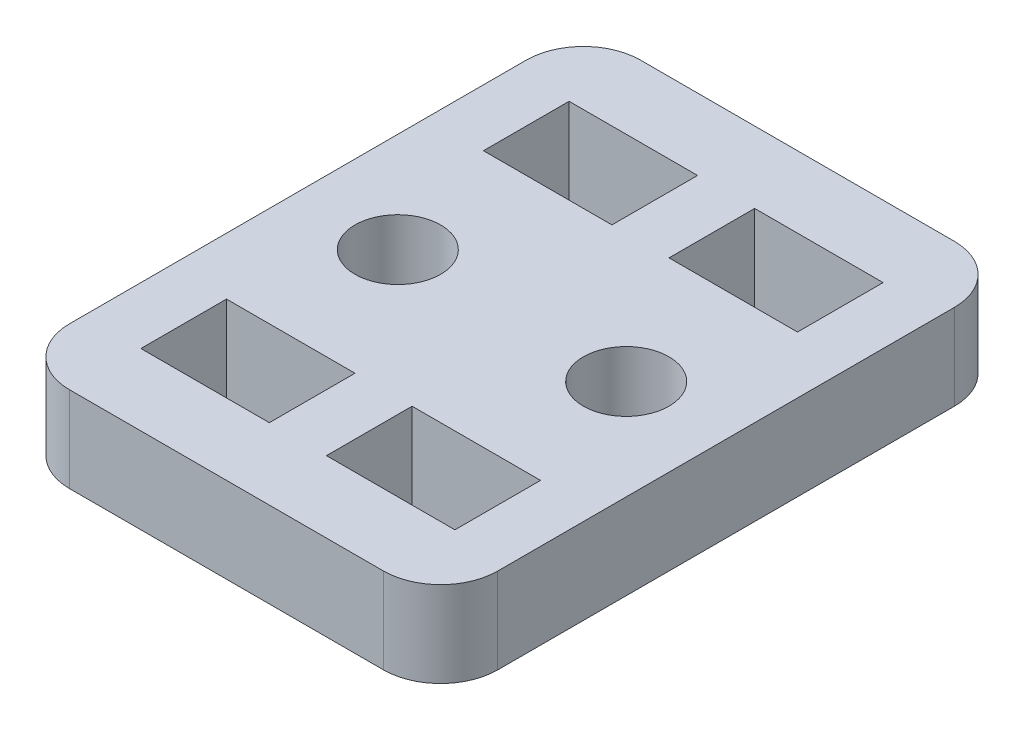
ISO-10303-21;
HEADER;
FILE_DESCRIPTION(('STEP AP214'),'2;1');
FILE_NAME('part.step','',(''),(''),'','','');
FILE_SCHEMA(('AUTOMOTIVE_DESIGN { 1 0 10303 214 1 1 1 1 }'));
ENDSEC;
DATA;
#1=APPLICATION_CONTEXT('core data for automotive mechanical design processes');
#2=APPLICATION_PROTOCOL_DEFINITION('international standard','automotive_design',2000,#1);
#3=PRODUCT_CONTEXT('',#1,'mechanical');
#4=PRODUCT('Part','Part','',(#3));
#5=PRODUCT_RELATED_PRODUCT_CATEGORY('part','',(#4));
#6=PRODUCT_DEFINITION_FORMATION('','',#4);
#7=PRODUCT_DEFINITION_CONTEXT('part definition',#1,'design');
#8=PRODUCT_DEFINITION('design','',#6,#7);
#9=PRODUCT_DEFINITION_SHAPE('','',#8);
#10=(LENGTH_UNIT() NAMED_UNIT(*) SI_UNIT(.MILLI.,.METRE.));
#11=(NAMED_UNIT(*) PLANE_ANGLE_UNIT() SI_UNIT($,.RADIAN.));
#12=(NAMED_UNIT(*) SI_UNIT($,.STERADIAN.) SOLID_ANGLE_UNIT());
#13=UNCERTAINTY_MEASURE_WITH_UNIT(LENGTH_MEASURE(1.E-05),#10,'distance_accuracy_value','');
#14=(GEOMETRIC_REPRESENTATION_CONTEXT(3) GLOBAL_UNCERTAINTY_ASSIGNED_CONTEXT((#13)) GLOBAL_UNIT_ASSIGNED_CONTEXT((#10,
#11,#12)) REPRESENTATION_CONTEXT('',''));
#15=CARTESIAN_POINT('',(0.,0.,0.));
#16=DIRECTION('',(0.,0.,1.));
#17=DIRECTION('',(1.,0.,0.));
#18=AXIS2_PLACEMENT_3D('',#15,#16,#17);
#19=CARTESIAN_POINT('',(0.,0.,0.));
#20=DIRECTION('',(0.,1.,0.));
#21=DIRECTION('',(0.,0.,1.));
#22=AXIS2_PLACEMENT_3D('',#19,#20,#21);
#23=PLANE('',#22);
#24=CARTESIAN_POINT('',(-4.,0.,0.));
#25=DIRECTION('',(0.,1.,0.));
#26=DIRECTION('',(0.,0.,1.));
#27=AXIS2_PLACEMENT_3D('',#24,#25,#26);
#28=CIRCLE('',#27,1.5);
#29=CARTESIAN_POINT('',(-4.,0.,1.5));
#30=VERTEX_POINT('',#29);
#31=EDGE_CURVE('E315',#30,#30,#28,.T.);
#32=ORIENTED_EDGE('',*,*,#31,.T.);
#33=EDGE_LOOP('',(#32));
#34=FACE_BOUND('',#33,.T.);
#35=CARTESIAN_POINT('',(4.,0.,0.));
#36=DIRECTION('',(0.,1.,0.));
#37=DIRECTION('',(0.,0.,1.));
#38=AXIS2_PLACEMENT_3D('',#35,#36,#37);
#39=CIRCLE('',#38,1.5);
#40=CARTESIAN_POINT('',(4.,0.,1.5));
#41=VERTEX_POINT('',#40);
#42=EDGE_CURVE('E830',#41,#41,#39,.T.);
#43=ORIENTED_EDGE('',*,*,#42,.T.);
#44=EDGE_LOOP('',(#43));
#45=FACE_BOUND('',#44,.T.);
#46=DIRECTION('',(0.,0.,-1.));
#47=VECTOR('',#46,1.);
#48=CARTESIAN_POINT('',(1.,0.,-4.5));
#49=LINE('',#48,#47);
#50=CARTESIAN_POINT('',(1.,0.,-4.5));
#51=VERTEX_POINT('',#50);
#52=CARTESIAN_POINT('',(1.,0.,-7.5));
#53=VERTEX_POINT('',#52);
#54=EDGE_CURVE('E75',#51,#53,#49,.T.);
#55=ORIENTED_EDGE('',*,*,#54,.F.);
#56=DIRECTION('',(-1.,0.,0.));
#57=VECTOR('',#56,1.);
#58=CARTESIAN_POINT('',(5.5,0.,-4.5));
#59=LINE('',#58,#57);
#60=CARTESIAN_POINT('',(5.5,0.,-4.5));
#61=VERTEX_POINT('',#60);
#62=EDGE_CURVE('E310',#61,#51,#59,.T.);
#63=ORIENTED_EDGE('',*,*,#62,.F.);
#64=DIRECTION('',(0.,0.,1.));
#65=VECTOR('',#64,1.);
#66=CARTESIAN_POINT('',(5.5,0.,-7.5));
#67=LINE('',#66,#65);
#68=CARTESIAN_POINT('',(5.5,0.,-7.5));
#69=VERTEX_POINT('',#68);
#70=EDGE_CURVE('E338',#69,#61,#67,.T.);
#71=ORIENTED_EDGE('',*,*,#70,.F.);
#72=DIRECTION('',(1.,0.,0.));
#73=VECTOR('',#72,1.);
#74=CARTESIAN_POINT('',(1.,0.,-7.5));
#75=LINE('',#74,#73);
#76=EDGE_CURVE('E336',#53,#69,#75,.T.);
#77=ORIENTED_EDGE('',*,*,#76,.F.);
#78=EDGE_LOOP('',(#55,#63,#71,#77));
#79=FACE_BOUND('',#78,.T.);
#80=DIRECTION('',(-1.,0.,0.));
#81=VECTOR('',#80,1.);
#82=CARTESIAN_POINT('',(5.5,0.,7.5));
#83=LINE('',#82,#81);
#84=CARTESIAN_POINT('',(5.5,0.,7.5));
#85=VERTEX_POINT('',#84);
#86=CARTESIAN_POINT('',(1.,0.,7.5));
#87=VERTEX_POINT('',#86);
#88=EDGE_CURVE('E285',#85,#87,#83,.T.);
#89=ORIENTED_EDGE('',*,*,#88,.F.);
#90=DIRECTION('',(0.,0.,1.));
#91=VECTOR('',#90,1.);
#92=CARTESIAN_POINT('',(5.5,0.,4.5));
#93=LINE('',#92,#91);
#94=CARTESIAN_POINT('',(5.5,0.,4.5));
#95=VERTEX_POINT('',#94);
#96=EDGE_CURVE('E309',#95,#85,#93,.T.);
#97=ORIENTED_EDGE('',*,*,#96,.F.);
#98=DIRECTION('',(1.,0.,0.));
#99=VECTOR('',#98,1.);
#100=CARTESIAN_POINT('',(1.,0.,4.5));
#101=LINE('',#100,#99);
#102=CARTESIAN_POINT('',(1.,0.,4.5));
#103=VERTEX_POINT('',#102);
#104=EDGE_CURVE('E272',#103,#95,#101,.T.);
#105=ORIENTED_EDGE('',*,*,#104,.F.);
#106=DIRECTION('',(0.,0.,-1.));
#107=VECTOR('',#106,1.);
#108=CARTESIAN_POINT('',(1.,0.,7.5));
#109=LINE('',#108,#107);
#110=EDGE_CURVE('E321',#87,#103,#109,.T.);
#111=ORIENTED_EDGE('',*,*,#110,.F.);
#112=EDGE_LOOP('',(#89,#97,#105,#111));
#113=FACE_BOUND('',#112,.T.);
#114=DIRECTION('',(-1.,0.,0.));
#115=VECTOR('',#114,1.);
#116=CARTESIAN_POINT('',(-1.,0.,-4.5));
#117=LINE('',#116,#115);
#118=CARTESIAN_POINT('',(-1.,0.,-4.5));
#119=VERTEX_POINT('',#118);
#120=CARTESIAN_POINT('',(-5.5,0.,-4.5));
#121=VERTEX_POINT('',#120);
#122=EDGE_CURVE('E316',#119,#121,#117,.T.);
#123=ORIENTED_EDGE('',*,*,#122,.F.);
#124=DIRECTION('',(0.,0.,1.));
#125=VECTOR('',#124,1.);
#126=CARTESIAN_POINT('',(-1.,0.,-7.5));
#127=LINE('',#126,#125);
#128=CARTESIAN_POINT('',(-1.,0.,-7.5));
#129=VERTEX_POINT('',#128);
#130=EDGE_CURVE('E402',#129,#119,#127,.T.);
#131=ORIENTED_EDGE('',*,*,#130,.F.);
#132=DIRECTION('',(1.,0.,0.));
#133=VECTOR('',#132,1.);
#134=CARTESIAN_POINT('',(-5.5,0.,-7.5));
#135=LINE('',#134,#133);
#136=CARTESIAN_POINT('',(-5.5,0.,-7.5));
#137=VERTEX_POINT('',#136);
#138=EDGE_CURVE('E175',#137,#129,#135,.T.);
#139=ORIENTED_EDGE('',*,*,#138,.F.);
#140=DIRECTION('',(0.,0.,-1.));
#141=VECTOR('',#140,1.);
#142=CARTESIAN_POINT('',(-5.5,0.,-4.5));
#143=LINE('',#142,#141);
#144=EDGE_CURVE('E249',#121,#137,#143,.T.);
#145=ORIENTED_EDGE('',*,*,#144,.F.);
#146=EDGE_LOOP('',(#123,#131,#139,#145));
#147=FACE_BOUND('',#146,.T.);
#148=DIRECTION('',(1.,0.,0.));
#149=VECTOR('',#148,1.);
#150=CARTESIAN_POINT('',(-5.5,0.,4.5));
#151=LINE('',#150,#149);
#152=CARTESIAN_POINT('',(-5.5,0.,4.5));
#153=VERTEX_POINT('',#152);
#154=CARTESIAN_POINT('',(-1.,0.,4.5));
#155=VERTEX_POINT('',#154);
#156=EDGE_CURVE('E290',#153,#155,#151,.T.);
#157=ORIENTED_EDGE('',*,*,#156,.F.);
#158=DIRECTION('',(0.,0.,-1.));
#159=VECTOR('',#158,1.);
#160=CARTESIAN_POINT('',(-5.5,0.,7.5));
#161=LINE('',#160,#159);
#162=CARTESIAN_POINT('',(-5.5,0.,7.5));
#163=VERTEX_POINT('',#162);
#164=EDGE_CURVE('E384',#163,#153,#161,.T.);
#165=ORIENTED_EDGE('',*,*,#164,.F.);
#166=DIRECTION('',(-1.,0.,0.));
#167=VECTOR('',#166,1.);
#168=CARTESIAN_POINT('',(-1.,0.,7.5));
#169=LINE('',#168,#167);
#170=CARTESIAN_POINT('',(-1.,0.,7.5));
#171=VERTEX_POINT('',#170);
#172=EDGE_CURVE('E237',#171,#163,#169,.T.);
#173=ORIENTED_EDGE('',*,*,#172,.F.);
#174=DIRECTION('',(0.,0.,1.));
#175=VECTOR('',#174,1.);
#176=CARTESIAN_POINT('',(-1.,0.,4.5));
#177=LINE('',#176,#175);
#178=EDGE_CURVE('E277',#155,#171,#177,.T.);
#179=ORIENTED_EDGE('',*,*,#178,.F.);
#180=EDGE_LOOP('',(#157,#165,#173,#179));
#181=FACE_BOUND('',#180,.T.);
#182=DIRECTION('',(-1.,0.,0.));
#183=VECTOR('',#182,1.);
#184=CARTESIAN_POINT('',(5.5,0.,-10.));
#185=LINE('',#184,#183);
#186=CARTESIAN_POINT('',(5.5,0.,-10.));
#187=VERTEX_POINT('',#186);
#188=CARTESIAN_POINT('',(-5.5,0.,-10.));
#189=VERTEX_POINT('',#188);
#190=EDGE_CURVE('E52',#187,#189,#185,.T.);
#191=ORIENTED_EDGE('',*,*,#190,.F.);
#192=CARTESIAN_POINT('',(5.5,0.,-8.));
#193=DIRECTION('',(0.,1.,0.));
#194=DIRECTION('',(1.,0.,0.));
#195=AXIS2_PLACEMENT_3D('',#192,#193,#194);
#196=CIRCLE('',#195,2.);
#197=CARTESIAN_POINT('',(7.5,0.,-8.));
#198=VERTEX_POINT('',#197);
#199=EDGE_CURVE('E305',#198,#187,#196,.T.);
#200=ORIENTED_EDGE('',*,*,#199,.F.);
#201=DIRECTION('',(0.,0.,-1.));
#202=VECTOR('',#201,1.);
#203=CARTESIAN_POINT('',(7.5,0.,8.));
#204=LINE('',#203,#202);
#205=CARTESIAN_POINT('',(7.5,0.,8.));
#206=VERTEX_POINT('',#205);
#207=EDGE_CURVE('E223',#206,#198,#204,.T.);
#208=ORIENTED_EDGE('',*,*,#207,.F.);
#209=CARTESIAN_POINT('',(5.5,0.,8.));
#210=DIRECTION('',(0.,1.,0.));
#211=DIRECTION('',(0.,0.,1.));
#212=AXIS2_PLACEMENT_3D('',#209,#210,#211);
#213=CIRCLE('',#212,2.);
#214=CARTESIAN_POINT('',(5.5,0.,10.));
#215=VERTEX_POINT('',#214);
#216=EDGE_CURVE('E217',#215,#206,#213,.T.);
#217=ORIENTED_EDGE('',*,*,#216,.F.);
#218=DIRECTION('',(1.,0.,0.));
#219=VECTOR('',#218,1.);
#220=CARTESIAN_POINT('',(-5.5,0.,10.));
#221=LINE('',#220,#219);
#222=CARTESIAN_POINT('',(-5.5,0.,10.));
#223=VERTEX_POINT('',#222);
#224=EDGE_CURVE('E45',#223,#215,#221,.T.);
#225=ORIENTED_EDGE('',*,*,#224,.F.);
#226=CARTESIAN_POINT('',(-5.5,0.,8.));
#227=DIRECTION('',(0.,1.,0.));
#228=DIRECTION('',(-1.,0.,0.));
#229=AXIS2_PLACEMENT_3D('',#226,#227,#228);
#230=CIRCLE('',#229,2.);
#231=CARTESIAN_POINT('',(-7.5,0.,8.));
#232=VERTEX_POINT('',#231);
#233=EDGE_CURVE('E243',#232,#223,#230,.T.);
#234=ORIENTED_EDGE('',*,*,#233,.F.);
#235=DIRECTION('',(0.,0.,1.));
#236=VECTOR('',#235,1.);
#237=CARTESIAN_POINT('',(-7.5,0.,-8.));
#238=LINE('',#237,#236);
#239=CARTESIAN_POINT('',(-7.5,0.,-8.));
#240=VERTEX_POINT('',#239);
#241=EDGE_CURVE('E146',#240,#232,#238,.T.);
#242=ORIENTED_EDGE('',*,*,#241,.F.);
#243=CARTESIAN_POINT('',(-5.5,0.,-8.));
#244=DIRECTION('',(0.,1.,0.));
#245=DIRECTION('',(0.,0.,-1.));
#246=AXIS2_PLACEMENT_3D('',#243,#244,#245);
#247=CIRCLE('',#246,2.);
#248=EDGE_CURVE('E267',#189,#240,#247,.T.);
#249=ORIENTED_EDGE('',*,*,#248,.F.);
#250=EDGE_LOOP('',(#191,#200,#208,#217,#225,#234,#242,#249));
#251=FACE_BOUND('',#250,.T.);
#252=ADVANCED_FACE('F41',(#34,#45,#79,#113,#147,#181,#251),#23,.F.);
#253=CARTESIAN_POINT('',(0.,3.,0.));
#254=DIRECTION('',(0.,1.,0.));
#255=DIRECTION('',(0.,0.,1.));
#256=AXIS2_PLACEMENT_3D('',#253,#254,#255);
#257=PLANE('',#256);
#258=CARTESIAN_POINT('',(-4.,3.,0.));
#259=DIRECTION('',(0.,1.,0.));
#260=DIRECTION('',(0.,0.,1.));
#261=AXIS2_PLACEMENT_3D('',#258,#259,#260);
#262=CIRCLE('',#261,1.5);
#263=CARTESIAN_POINT('',(-4.,3.,1.5));
#264=VERTEX_POINT('',#263);
#265=EDGE_CURVE('E828',#264,#264,#262,.T.);
#266=ORIENTED_EDGE('',*,*,#265,.F.);
#267=EDGE_LOOP('',(#266));
#268=FACE_BOUND('',#267,.T.);
#269=CARTESIAN_POINT('',(4.,3.,0.));
#270=DIRECTION('',(0.,1.,0.));
#271=DIRECTION('',(0.,0.,1.));
#272=AXIS2_PLACEMENT_3D('',#269,#270,#271);
#273=CIRCLE('',#272,1.5);
#274=CARTESIAN_POINT('',(4.,3.,1.5));
#275=VERTEX_POINT('',#274);
#276=EDGE_CURVE('E834',#275,#275,#273,.T.);
#277=ORIENTED_EDGE('',*,*,#276,.F.);
#278=EDGE_LOOP('',(#277));
#279=FACE_BOUND('',#278,.T.);
#280=DIRECTION('',(0.,0.,-1.));
#281=VECTOR('',#280,1.);
#282=CARTESIAN_POINT('',(1.,3.,-4.5));
#283=LINE('',#282,#281);
#284=CARTESIAN_POINT('',(1.,3.,-4.5));
#285=VERTEX_POINT('',#284);
#286=CARTESIAN_POINT('',(1.,3.,-7.5));
#287=VERTEX_POINT('',#286);
#288=EDGE_CURVE('E306',#285,#287,#283,.T.);
#289=ORIENTED_EDGE('',*,*,#288,.T.);
#290=DIRECTION('',(1.,0.,0.));
#291=VECTOR('',#290,1.);
#292=CARTESIAN_POINT('',(1.,3.,-7.5));
#293=LINE('',#292,#291);
#294=CARTESIAN_POINT('',(5.5,3.,-7.5));
#295=VERTEX_POINT('',#294);
#296=EDGE_CURVE('E86',#287,#295,#293,.T.);
#297=ORIENTED_EDGE('',*,*,#296,.T.);
#298=DIRECTION('',(0.,0.,1.));
#299=VECTOR('',#298,1.);
#300=CARTESIAN_POINT('',(5.5,3.,-7.5));
#301=LINE('',#300,#299);
#302=CARTESIAN_POINT('',(5.5,3.,-4.5));
#303=VERTEX_POINT('',#302);
#304=EDGE_CURVE('E337',#295,#303,#301,.T.);
#305=ORIENTED_EDGE('',*,*,#304,.T.);
#306=DIRECTION('',(-1.,0.,0.));
#307=VECTOR('',#306,1.);
#308=CARTESIAN_POINT('',(5.5,3.,-4.5));
#309=LINE('',#308,#307);
#310=EDGE_CURVE('E374',#303,#285,#309,.T.);
#311=ORIENTED_EDGE('',*,*,#310,.T.);
#312=EDGE_LOOP('',(#289,#297,#305,#311));
#313=FACE_BOUND('',#312,.T.);
#314=DIRECTION('',(-1.,0.,0.));
#315=VECTOR('',#314,1.);
#316=CARTESIAN_POINT('',(5.5,3.,7.5));
#317=LINE('',#316,#315);
#318=CARTESIAN_POINT('',(5.5,3.,7.5));
#319=VERTEX_POINT('',#318);
#320=CARTESIAN_POINT('',(1.,3.,7.5));
#321=VERTEX_POINT('',#320);
#322=EDGE_CURVE('E183',#319,#321,#317,.T.);
#323=ORIENTED_EDGE('',*,*,#322,.T.);
#324=DIRECTION('',(0.,0.,-1.));
#325=VECTOR('',#324,1.);
#326=CARTESIAN_POINT('',(1.,3.,7.5));
#327=LINE('',#326,#325);
#328=CARTESIAN_POINT('',(1.,3.,4.5));
#329=VERTEX_POINT('',#328);
#330=EDGE_CURVE('E286',#321,#329,#327,.T.);
#331=ORIENTED_EDGE('',*,*,#330,.T.);
#332=DIRECTION('',(1.,0.,0.));
#333=VECTOR('',#332,1.);
#334=CARTESIAN_POINT('',(1.,3.,4.5));
#335=LINE('',#334,#333);
#336=CARTESIAN_POINT('',(5.5,3.,4.5));
#337=VERTEX_POINT('',#336);
#338=EDGE_CURVE('E275',#329,#337,#335,.T.);
#339=ORIENTED_EDGE('',*,*,#338,.T.);
#340=DIRECTION('',(0.,0.,1.));
#341=VECTOR('',#340,1.);
#342=CARTESIAN_POINT('',(5.5,3.,4.5));
#343=LINE('',#342,#341);
#344=EDGE_CURVE('E330',#337,#319,#343,.T.);
#345=ORIENTED_EDGE('',*,*,#344,.T.);
#346=EDGE_LOOP('',(#323,#331,#339,#345));
#347=FACE_BOUND('',#346,.T.);
#348=DIRECTION('',(-1.,0.,0.));
#349=VECTOR('',#348,1.);
#350=CARTESIAN_POINT('',(-1.,3.,-4.5));
#351=LINE('',#350,#349);
#352=CARTESIAN_POINT('',(-1.,3.,-4.5));
#353=VERTEX_POINT('',#352);
#354=CARTESIAN_POINT('',(-5.5,3.,-4.5));
#355=VERTEX_POINT('',#354);
#356=EDGE_CURVE('E319',#353,#355,#351,.T.);
#357=ORIENTED_EDGE('',*,*,#356,.T.);
#358=DIRECTION('',(0.,0.,-1.));
#359=VECTOR('',#358,1.);
#360=CARTESIAN_POINT('',(-5.5,3.,-4.5));
#361=LINE('',#360,#359);
#362=CARTESIAN_POINT('',(-5.5,3.,-7.5));
#363=VERTEX_POINT('',#362);
#364=EDGE_CURVE('E253',#355,#363,#361,.T.);
#365=ORIENTED_EDGE('',*,*,#364,.T.);
#366=DIRECTION('',(1.,0.,0.));
#367=VECTOR('',#366,1.);
#368=CARTESIAN_POINT('',(-5.5,3.,-7.5));
#369=LINE('',#368,#367);
#370=CARTESIAN_POINT('',(-1.,3.,-7.5));
#371=VERTEX_POINT('',#370);
#372=EDGE_CURVE('E271',#363,#371,#369,.T.);
#373=ORIENTED_EDGE('',*,*,#372,.T.);
#374=DIRECTION('',(0.,0.,1.));
#375=VECTOR('',#374,1.);
#376=CARTESIAN_POINT('',(-1.,3.,-7.5));
#377=LINE('',#376,#375);
#378=EDGE_CURVE('E289',#371,#353,#377,.T.);
#379=ORIENTED_EDGE('',*,*,#378,.T.);
#380=EDGE_LOOP('',(#357,#365,#373,#379));
#381=FACE_BOUND('',#380,.T.);
#382=DIRECTION('',(1.,0.,0.));
#383=VECTOR('',#382,1.);
#384=CARTESIAN_POINT('',(-5.5,3.,4.5));
#385=LINE('',#384,#383);
#386=CARTESIAN_POINT('',(-5.5,3.,4.5));
#387=VERTEX_POINT('',#386);
#388=CARTESIAN_POINT('',(-1.,3.,4.5));
#389=VERTEX_POINT('',#388);
#390=EDGE_CURVE('E294',#387,#389,#385,.T.);
#391=ORIENTED_EDGE('',*,*,#390,.T.);
#392=DIRECTION('',(0.,0.,1.));
#393=VECTOR('',#392,1.);
#394=CARTESIAN_POINT('',(-1.,3.,4.5));
#395=LINE('',#394,#393);
#396=CARTESIAN_POINT('',(-1.,3.,7.5));
#397=VERTEX_POINT('',#396);
#398=EDGE_CURVE('E281',#389,#397,#395,.T.);
#399=ORIENTED_EDGE('',*,*,#398,.T.);
#400=DIRECTION('',(-1.,0.,0.));
#401=VECTOR('',#400,1.);
#402=CARTESIAN_POINT('',(-1.,3.,7.5));
#403=LINE('',#402,#401);
#404=CARTESIAN_POINT('',(-5.5,3.,7.5));
#405=VERTEX_POINT('',#404);
#406=EDGE_CURVE('E240',#397,#405,#403,.T.);
#407=ORIENTED_EDGE('',*,*,#406,.T.);
#408=DIRECTION('',(0.,0.,-1.));
#409=VECTOR('',#408,1.);
#410=CARTESIAN_POINT('',(-5.5,3.,7.5));
#411=LINE('',#410,#409);
#412=EDGE_CURVE('E399',#405,#387,#411,.T.);
#413=ORIENTED_EDGE('',*,*,#412,.T.);
#414=EDGE_LOOP('',(#391,#399,#407,#413));
#415=FACE_BOUND('',#414,.T.);
#416=DIRECTION('',(-1.,0.,0.));
#417=VECTOR('',#416,1.);
#418=CARTESIAN_POINT('',(5.5,3.,-10.));
#419=LINE('',#418,#417);
#420=CARTESIAN_POINT('',(5.5,3.,-10.));
#421=VERTEX_POINT('',#420);
#422=CARTESIAN_POINT('',(-5.5,3.,-10.));
#423=VERTEX_POINT('',#422);
#424=EDGE_CURVE('E11',#421,#423,#419,.T.);
#425=ORIENTED_EDGE('',*,*,#424,.T.);
#426=CARTESIAN_POINT('',(-5.5,3.,-8.));
#427=DIRECTION('',(0.,1.,0.));
#428=DIRECTION('',(0.,0.,-1.));
#429=AXIS2_PLACEMENT_3D('',#426,#427,#428);
#430=CIRCLE('',#429,2.);
#431=CARTESIAN_POINT('',(-7.5,3.,-8.));
#432=VERTEX_POINT('',#431);
#433=EDGE_CURVE('E259',#423,#432,#430,.T.);
#434=ORIENTED_EDGE('',*,*,#433,.T.);
#435=DIRECTION('',(0.,0.,1.));
#436=VECTOR('',#435,1.);
#437=CARTESIAN_POINT('',(-7.5,3.,-8.));
#438=LINE('',#437,#436);
#439=CARTESIAN_POINT('',(-7.5,3.,8.));
#440=VERTEX_POINT('',#439);
#441=EDGE_CURVE('E268',#432,#440,#438,.T.);
#442=ORIENTED_EDGE('',*,*,#441,.T.);
#443=CARTESIAN_POINT('',(-5.5,3.,8.));
#444=DIRECTION('',(0.,1.,0.));
#445=DIRECTION('',(-1.,0.,0.));
#446=AXIS2_PLACEMENT_3D('',#443,#444,#445);
#447=CIRCLE('',#446,2.);
#448=CARTESIAN_POINT('',(-5.5,3.,10.));
#449=VERTEX_POINT('',#448);
#450=EDGE_CURVE('E152',#440,#449,#447,.T.);
#451=ORIENTED_EDGE('',*,*,#450,.T.);
#452=DIRECTION('',(1.,0.,0.));
#453=VECTOR('',#452,1.);
#454=CARTESIAN_POINT('',(-5.5,3.,10.));
#455=LINE('',#454,#453);
#456=CARTESIAN_POINT('',(5.5,3.,10.));
#457=VERTEX_POINT('',#456);
#458=EDGE_CURVE('E214',#449,#457,#455,.T.);
#459=ORIENTED_EDGE('',*,*,#458,.T.);
#460=CARTESIAN_POINT('',(5.5,3.,8.));
#461=DIRECTION('',(0.,1.,0.));
#462=DIRECTION('',(0.,0.,1.));
#463=AXIS2_PLACEMENT_3D('',#460,#461,#462);
#464=CIRCLE('',#463,2.);
#465=CARTESIAN_POINT('',(7.5,3.,8.));
#466=VERTEX_POINT('',#465);
#467=EDGE_CURVE('E198',#457,#466,#464,.T.);
#468=ORIENTED_EDGE('',*,*,#467,.T.);
#469=DIRECTION('',(0.,0.,-1.));
#470=VECTOR('',#469,1.);
#471=CARTESIAN_POINT('',(7.5,3.,8.));
#472=LINE('',#471,#470);
#473=CARTESIAN_POINT('',(7.5,3.,-8.));
#474=VERTEX_POINT('',#473);
#475=EDGE_CURVE('E232',#466,#474,#472,.T.);
#476=ORIENTED_EDGE('',*,*,#475,.T.);
#477=CARTESIAN_POINT('',(5.5,3.,-8.));
#478=DIRECTION('',(0.,1.,0.));
#479=DIRECTION('',(1.,0.,0.));
#480=AXIS2_PLACEMENT_3D('',#477,#478,#479);
#481=CIRCLE('',#480,2.);
#482=EDGE_CURVE('E244',#474,#421,#481,.T.);
#483=ORIENTED_EDGE('',*,*,#482,.T.);
#484=EDGE_LOOP('',(#425,#434,#442,#451,#459,#468,#476,#483));
#485=FACE_BOUND('',#484,.T.);
#486=ADVANCED_FACE('F423',(#268,#279,#313,#347,#381,#415,#485),#257,.T.);
#487=CARTESIAN_POINT('',(5.5,0.,-10.));
#488=DIRECTION('',(0.,0.,-1.));
#489=DIRECTION('',(-1.,0.,0.));
#490=AXIS2_PLACEMENT_3D('',#487,#488,#489);
#491=PLANE('',#490);
#492=ORIENTED_EDGE('',*,*,#190,.T.);
#493=DIRECTION('',(0.,1.,0.));
#494=VECTOR('',#493,1.);
#495=CARTESIAN_POINT('',(-5.5,0.,-10.));
#496=LINE('',#495,#494);
#497=EDGE_CURVE('E257',#189,#423,#496,.T.);
#498=ORIENTED_EDGE('',*,*,#497,.T.);
#499=ORIENTED_EDGE('',*,*,#424,.F.);
#500=DIRECTION('',(0.,1.,0.));
#501=VECTOR('',#500,1.);
#502=CARTESIAN_POINT('',(5.5,0.,-10.));
#503=LINE('',#502,#501);
#504=EDGE_CURVE('E248',#187,#421,#503,.T.);
#505=ORIENTED_EDGE('',*,*,#504,.F.);
#506=EDGE_LOOP('',(#492,#498,#499,#505));
#507=FACE_BOUND('',#506,.T.);
#508=ADVANCED_FACE('F520',(#507),#491,.T.);
#509=CARTESIAN_POINT('',(-5.5,0.,-8.));
#510=DIRECTION('',(0.,-1.,0.));
#511=DIRECTION('',(0.,0.,-1.));
#512=AXIS2_PLACEMENT_3D('',#509,#510,#511);
#513=CYLINDRICAL_SURFACE('',#512,2.);
#514=ORIENTED_EDGE('',*,*,#248,.T.);
#515=DIRECTION('',(0.,1.,0.));
#516=VECTOR('',#515,1.);
#517=CARTESIAN_POINT('',(-7.5,0.,-8.));
#518=LINE('',#517,#516);
#519=EDGE_CURVE('E264',#240,#432,#518,.T.);
#520=ORIENTED_EDGE('',*,*,#519,.T.);
#521=ORIENTED_EDGE('',*,*,#433,.F.);
#522=ORIENTED_EDGE('',*,*,#497,.F.);
#523=EDGE_LOOP('',(#514,#520,#521,#522));
#524=FACE_BOUND('',#523,.T.);
#525=ADVANCED_FACE('F43',(#524),#513,.T.);
#526=CARTESIAN_POINT('',(-7.5,0.,-8.));
#527=DIRECTION('',(-1.,0.,0.));
#528=DIRECTION('',(0.,0.,1.));
#529=AXIS2_PLACEMENT_3D('',#526,#527,#528);
#530=PLANE('',#529);
#531=ORIENTED_EDGE('',*,*,#241,.T.);
#532=DIRECTION('',(0.,1.,0.));
#533=VECTOR('',#532,1.);
#534=CARTESIAN_POINT('',(-7.5,0.,8.));
#535=LINE('',#534,#533);
#536=EDGE_CURVE('E262',#232,#440,#535,.T.);
#537=ORIENTED_EDGE('',*,*,#536,.T.);
#538=ORIENTED_EDGE('',*,*,#441,.F.);
#539=ORIENTED_EDGE('',*,*,#519,.F.);
#540=EDGE_LOOP('',(#531,#537,#538,#539));
#541=FACE_BOUND('',#540,.T.);
#542=ADVANCED_FACE('F538',(#541),#530,.T.);
#543=CARTESIAN_POINT('',(-5.5,0.,8.));
#544=DIRECTION('',(0.,-1.,0.));
#545=DIRECTION('',(-1.,0.,0.));
#546=AXIS2_PLACEMENT_3D('',#543,#544,#545);
#547=CYLINDRICAL_SURFACE('',#546,2.);
#548=ORIENTED_EDGE('',*,*,#233,.T.);
#549=DIRECTION('',(0.,1.,0.));
#550=VECTOR('',#549,1.);
#551=CARTESIAN_POINT('',(-5.5,0.,10.));
#552=LINE('',#551,#550);
#553=EDGE_CURVE('E209',#223,#449,#552,.T.);
#554=ORIENTED_EDGE('',*,*,#553,.T.);
#555=ORIENTED_EDGE('',*,*,#450,.F.);
#556=ORIENTED_EDGE('',*,*,#536,.F.);
#557=EDGE_LOOP('',(#548,#554,#555,#556));
#558=FACE_BOUND('',#557,.T.);
#559=ADVANCED_FACE('F527',(#558),#547,.T.);
#560=CARTESIAN_POINT('',(-5.5,0.,10.));
#561=DIRECTION('',(0.,0.,1.));
#562=DIRECTION('',(1.,0.,0.));
#563=AXIS2_PLACEMENT_3D('',#560,#561,#562);
#564=PLANE('',#563);
#565=ORIENTED_EDGE('',*,*,#224,.T.);
#566=DIRECTION('',(0.,1.,0.));
#567=VECTOR('',#566,1.);
#568=CARTESIAN_POINT('',(5.5,0.,10.));
#569=LINE('',#568,#567);
#570=EDGE_CURVE('E208',#215,#457,#569,.T.);
#571=ORIENTED_EDGE('',*,*,#570,.T.);
#572=ORIENTED_EDGE('',*,*,#458,.F.);
#573=ORIENTED_EDGE('',*,*,#553,.F.);
#574=EDGE_LOOP('',(#565,#571,#572,#573));
#575=FACE_BOUND('',#574,.T.);
#576=ADVANCED_FACE('F206',(#575),#564,.T.);
#577=CARTESIAN_POINT('',(5.5,0.,8.));
#578=DIRECTION('',(0.,-1.,0.));
#579=DIRECTION('',(0.,0.,1.));
#580=AXIS2_PLACEMENT_3D('',#577,#578,#579);
#581=CYLINDRICAL_SURFACE('',#580,2.);
#582=ORIENTED_EDGE('',*,*,#216,.T.);
#583=DIRECTION('',(0.,1.,0.));
#584=VECTOR('',#583,1.);
#585=CARTESIAN_POINT('',(7.5,0.,8.));
#586=LINE('',#585,#584);
#587=EDGE_CURVE('E225',#206,#466,#586,.T.);
#588=ORIENTED_EDGE('',*,*,#587,.T.);
#589=ORIENTED_EDGE('',*,*,#467,.F.);
#590=ORIENTED_EDGE('',*,*,#570,.F.);
#591=EDGE_LOOP('',(#582,#588,#589,#590));
#592=FACE_BOUND('',#591,.T.);
#593=ADVANCED_FACE('F216',(#592),#581,.T.);
#594=CARTESIAN_POINT('',(7.5,0.,8.));
#595=DIRECTION('',(1.,0.,0.));
#596=DIRECTION('',(0.,0.,-1.));
#597=AXIS2_PLACEMENT_3D('',#594,#595,#596);
#598=PLANE('',#597);
#599=ORIENTED_EDGE('',*,*,#207,.T.);
#600=DIRECTION('',(0.,1.,0.));
#601=VECTOR('',#600,1.);
#602=CARTESIAN_POINT('',(7.5,0.,-8.));
#603=LINE('',#602,#601);
#604=EDGE_CURVE('E247',#198,#474,#603,.T.);
#605=ORIENTED_EDGE('',*,*,#604,.T.);
#606=ORIENTED_EDGE('',*,*,#475,.F.);
#607=ORIENTED_EDGE('',*,*,#587,.F.);
#608=EDGE_LOOP('',(#599,#605,#606,#607));
#609=FACE_BOUND('',#608,.T.);
#610=ADVANCED_FACE('F544',(#609),#598,.T.);
#611=CARTESIAN_POINT('',(5.5,0.,-8.));
#612=DIRECTION('',(0.,-1.,0.));
#613=DIRECTION('',(1.,0.,0.));
#614=AXIS2_PLACEMENT_3D('',#611,#612,#613);
#615=CYLINDRICAL_SURFACE('',#614,2.);
#616=ORIENTED_EDGE('',*,*,#199,.T.);
#617=ORIENTED_EDGE('',*,*,#504,.T.);
#618=ORIENTED_EDGE('',*,*,#482,.F.);
#619=ORIENTED_EDGE('',*,*,#604,.F.);
#620=EDGE_LOOP('',(#616,#617,#618,#619));
#621=FACE_BOUND('',#620,.T.);
#622=ADVANCED_FACE('F541',(#621),#615,.T.);
#623=CARTESIAN_POINT('',(-5.5,0.,4.5));
#624=DIRECTION('',(0.,0.,1.));
#625=DIRECTION('',(1.,0.,0.));
#626=AXIS2_PLACEMENT_3D('',#623,#624,#625);
#627=PLANE('',#626);
#628=ORIENTED_EDGE('',*,*,#156,.T.);
#629=DIRECTION('',(0.,1.,0.));
#630=VECTOR('',#629,1.);
#631=CARTESIAN_POINT('',(-1.,0.,4.5));
#632=LINE('',#631,#630);
#633=EDGE_CURVE('E295',#155,#389,#632,.T.);
#634=ORIENTED_EDGE('',*,*,#633,.T.);
#635=ORIENTED_EDGE('',*,*,#390,.F.);
#636=DIRECTION('',(0.,1.,0.));
#637=VECTOR('',#636,1.);
#638=CARTESIAN_POINT('',(-5.5,0.,4.5));
#639=LINE('',#638,#637);
#640=EDGE_CURVE('E388',#153,#387,#639,.T.);
#641=ORIENTED_EDGE('',*,*,#640,.F.);
#642=EDGE_LOOP('',(#628,#634,#635,#641));
#643=FACE_BOUND('',#642,.T.);
#644=ADVANCED_FACE('F485',(#643),#627,.T.);
#645=CARTESIAN_POINT('',(-1.,0.,4.5));
#646=DIRECTION('',(-1.,0.,0.));
#647=DIRECTION('',(0.,0.,1.));
#648=AXIS2_PLACEMENT_3D('',#645,#646,#647);
#649=PLANE('',#648);
#650=ORIENTED_EDGE('',*,*,#178,.T.);
#651=DIRECTION('',(0.,1.,0.));
#652=VECTOR('',#651,1.);
#653=CARTESIAN_POINT('',(-1.,0.,7.5));
#654=LINE('',#653,#652);
#655=EDGE_CURVE('E282',#171,#397,#654,.T.);
#656=ORIENTED_EDGE('',*,*,#655,.T.);
#657=ORIENTED_EDGE('',*,*,#398,.F.);
#658=ORIENTED_EDGE('',*,*,#633,.F.);
#659=EDGE_LOOP('',(#650,#656,#657,#658));
#660=FACE_BOUND('',#659,.T.);
#661=ADVANCED_FACE('F490',(#660),#649,.T.);
#662=CARTESIAN_POINT('',(-1.,0.,7.5));
#663=DIRECTION('',(0.,0.,-1.));
#664=DIRECTION('',(-1.,0.,0.));
#665=AXIS2_PLACEMENT_3D('',#662,#663,#664);
#666=PLANE('',#665);
#667=ORIENTED_EDGE('',*,*,#172,.T.);
#668=DIRECTION('',(0.,1.,0.));
#669=VECTOR('',#668,1.);
#670=CARTESIAN_POINT('',(-5.5,0.,7.5));
#671=LINE('',#670,#669);
#672=EDGE_CURVE('E241',#163,#405,#671,.T.);
#673=ORIENTED_EDGE('',*,*,#672,.T.);
#674=ORIENTED_EDGE('',*,*,#406,.F.);
#675=ORIENTED_EDGE('',*,*,#655,.F.);
#676=EDGE_LOOP('',(#667,#673,#674,#675));
#677=FACE_BOUND('',#676,.T.);
#678=ADVANCED_FACE('F492',(#677),#666,.T.);
#679=CARTESIAN_POINT('',(-5.5,0.,7.5));
#680=DIRECTION('',(1.,0.,0.));
#681=DIRECTION('',(0.,0.,-1.));
#682=AXIS2_PLACEMENT_3D('',#679,#680,#681);
#683=PLANE('',#682);
#684=ORIENTED_EDGE('',*,*,#164,.T.);
#685=ORIENTED_EDGE('',*,*,#640,.T.);
#686=ORIENTED_EDGE('',*,*,#412,.F.);
#687=ORIENTED_EDGE('',*,*,#672,.F.);
#688=EDGE_LOOP('',(#684,#685,#686,#687));
#689=FACE_BOUND('',#688,.T.);
#690=ADVANCED_FACE('F498',(#689),#683,.T.);
#691=CARTESIAN_POINT('',(-1.,0.,-4.5));
#692=DIRECTION('',(0.,0.,-1.));
#693=DIRECTION('',(-1.,0.,0.));
#694=AXIS2_PLACEMENT_3D('',#691,#692,#693);
#695=PLANE('',#694);
#696=ORIENTED_EDGE('',*,*,#122,.T.);
#697=DIRECTION('',(0.,1.,0.));
#698=VECTOR('',#697,1.);
#699=CARTESIAN_POINT('',(-5.5,0.,-4.5));
#700=LINE('',#699,#698);
#701=EDGE_CURVE('E320',#121,#355,#700,.T.);
#702=ORIENTED_EDGE('',*,*,#701,.T.);
#703=ORIENTED_EDGE('',*,*,#356,.F.);
#704=DIRECTION('',(0.,1.,0.));
#705=VECTOR('',#704,1.);
#706=CARTESIAN_POINT('',(-1.,0.,-4.5));
#707=LINE('',#706,#705);
#708=EDGE_CURVE('E329',#119,#353,#707,.T.);
#709=ORIENTED_EDGE('',*,*,#708,.F.);
#710=EDGE_LOOP('',(#696,#702,#703,#709));
#711=FACE_BOUND('',#710,.T.);
#712=ADVANCED_FACE('F500',(#711),#695,.T.);
#713=CARTESIAN_POINT('',(-5.5,0.,-4.5));
#714=DIRECTION('',(1.,0.,0.));
#715=DIRECTION('',(0.,0.,-1.));
#716=AXIS2_PLACEMENT_3D('',#713,#714,#715);
#717=PLANE('',#716);
#718=ORIENTED_EDGE('',*,*,#144,.T.);
#719=DIRECTION('',(0.,1.,0.));
#720=VECTOR('',#719,1.);
#721=CARTESIAN_POINT('',(-5.5,0.,-7.5));
#722=LINE('',#721,#720);
#723=EDGE_CURVE('E254',#137,#363,#722,.T.);
#724=ORIENTED_EDGE('',*,*,#723,.T.);
#725=ORIENTED_EDGE('',*,*,#364,.F.);
#726=ORIENTED_EDGE('',*,*,#701,.F.);
#727=EDGE_LOOP('',(#718,#724,#725,#726));
#728=FACE_BOUND('',#727,.T.);
#729=ADVANCED_FACE('F506',(#728),#717,.T.);
#730=CARTESIAN_POINT('',(-5.5,0.,-7.5));
#731=DIRECTION('',(0.,0.,1.));
#732=DIRECTION('',(1.,0.,0.));
#733=AXIS2_PLACEMENT_3D('',#730,#731,#732);
#734=PLANE('',#733);
#735=ORIENTED_EDGE('',*,*,#138,.T.);
#736=DIRECTION('',(0.,1.,0.));
#737=VECTOR('',#736,1.);
#738=CARTESIAN_POINT('',(-1.,0.,-7.5));
#739=LINE('',#738,#737);
#740=EDGE_CURVE('E287',#129,#371,#739,.T.);
#741=ORIENTED_EDGE('',*,*,#740,.T.);
#742=ORIENTED_EDGE('',*,*,#372,.F.);
#743=ORIENTED_EDGE('',*,*,#723,.F.);
#744=EDGE_LOOP('',(#735,#741,#742,#743));
#745=FACE_BOUND('',#744,.T.);
#746=ADVANCED_FACE('F530',(#745),#734,.T.);
#747=CARTESIAN_POINT('',(-1.,0.,-7.5));
#748=DIRECTION('',(-1.,0.,0.));
#749=DIRECTION('',(0.,0.,1.));
#750=AXIS2_PLACEMENT_3D('',#747,#748,#749);
#751=PLANE('',#750);
#752=ORIENTED_EDGE('',*,*,#130,.T.);
#753=ORIENTED_EDGE('',*,*,#708,.T.);
#754=ORIENTED_EDGE('',*,*,#378,.F.);
#755=ORIENTED_EDGE('',*,*,#740,.F.);
#756=EDGE_LOOP('',(#752,#753,#754,#755));
#757=FACE_BOUND('',#756,.T.);
#758=ADVANCED_FACE('F533',(#757),#751,.T.);
#759=CARTESIAN_POINT('',(5.5,0.,7.5));
#760=DIRECTION('',(0.,0.,-1.));
#761=DIRECTION('',(-1.,0.,0.));
#762=AXIS2_PLACEMENT_3D('',#759,#760,#761);
#763=PLANE('',#762);
#764=ORIENTED_EDGE('',*,*,#88,.T.);
#765=DIRECTION('',(0.,1.,0.));
#766=VECTOR('',#765,1.);
#767=CARTESIAN_POINT('',(1.,0.,7.5));
#768=LINE('',#767,#766);
#769=EDGE_CURVE('E283',#87,#321,#768,.T.);
#770=ORIENTED_EDGE('',*,*,#769,.T.);
#771=ORIENTED_EDGE('',*,*,#322,.F.);
#772=DIRECTION('',(0.,1.,0.));
#773=VECTOR('',#772,1.);
#774=CARTESIAN_POINT('',(5.5,0.,7.5));
#775=LINE('',#774,#773);
#776=EDGE_CURVE('E333',#85,#319,#775,.T.);
#777=ORIENTED_EDGE('',*,*,#776,.F.);
#778=EDGE_LOOP('',(#764,#770,#771,#777));
#779=FACE_BOUND('',#778,.T.);
#780=ADVANCED_FACE('F536',(#779),#763,.T.);
#781=CARTESIAN_POINT('',(1.,0.,7.5));
#782=DIRECTION('',(1.,0.,0.));
#783=DIRECTION('',(0.,0.,-1.));
#784=AXIS2_PLACEMENT_3D('',#781,#782,#783);
#785=PLANE('',#784);
#786=ORIENTED_EDGE('',*,*,#110,.T.);
#787=DIRECTION('',(0.,1.,0.));
#788=VECTOR('',#787,1.);
#789=CARTESIAN_POINT('',(1.,0.,4.5));
#790=LINE('',#789,#788);
#791=EDGE_CURVE('E325',#103,#329,#790,.T.);
#792=ORIENTED_EDGE('',*,*,#791,.T.);
#793=ORIENTED_EDGE('',*,*,#330,.F.);
#794=ORIENTED_EDGE('',*,*,#769,.F.);
#795=EDGE_LOOP('',(#786,#792,#793,#794));
#796=FACE_BOUND('',#795,.T.);
#797=ADVANCED_FACE('F432',(#796),#785,.T.);
#798=CARTESIAN_POINT('',(1.,0.,4.5));
#799=DIRECTION('',(0.,0.,1.));
#800=DIRECTION('',(1.,0.,0.));
#801=AXIS2_PLACEMENT_3D('',#798,#799,#800);
#802=PLANE('',#801);
#803=ORIENTED_EDGE('',*,*,#104,.T.);
#804=DIRECTION('',(0.,1.,0.));
#805=VECTOR('',#804,1.);
#806=CARTESIAN_POINT('',(5.5,0.,4.5));
#807=LINE('',#806,#805);
#808=EDGE_CURVE('E276',#95,#337,#807,.T.);
#809=ORIENTED_EDGE('',*,*,#808,.T.);
#810=ORIENTED_EDGE('',*,*,#338,.F.);
#811=ORIENTED_EDGE('',*,*,#791,.F.);
#812=EDGE_LOOP('',(#803,#809,#810,#811));
#813=FACE_BOUND('',#812,.T.);
#814=ADVANCED_FACE('F436',(#813),#802,.T.);
#815=CARTESIAN_POINT('',(5.5,0.,4.5));
#816=DIRECTION('',(-1.,0.,0.));
#817=DIRECTION('',(0.,0.,1.));
#818=AXIS2_PLACEMENT_3D('',#815,#816,#817);
#819=PLANE('',#818);
#820=ORIENTED_EDGE('',*,*,#96,.T.);
#821=ORIENTED_EDGE('',*,*,#776,.T.);
#822=ORIENTED_EDGE('',*,*,#344,.F.);
#823=ORIENTED_EDGE('',*,*,#808,.F.);
#824=EDGE_LOOP('',(#820,#821,#822,#823));
#825=FACE_BOUND('',#824,.T.);
#826=ADVANCED_FACE('F442',(#825),#819,.T.);
#827=CARTESIAN_POINT('',(1.,0.,-4.5));
#828=DIRECTION('',(1.,0.,0.));
#829=DIRECTION('',(0.,0.,-1.));
#830=AXIS2_PLACEMENT_3D('',#827,#828,#829);
#831=PLANE('',#830);
#832=ORIENTED_EDGE('',*,*,#54,.T.);
#833=DIRECTION('',(0.,1.,0.));
#834=VECTOR('',#833,1.);
#835=CARTESIAN_POINT('',(1.,0.,-7.5));
#836=LINE('',#835,#834);
#837=EDGE_CURVE('E255',#53,#287,#836,.T.);
#838=ORIENTED_EDGE('',*,*,#837,.T.);
#839=ORIENTED_EDGE('',*,*,#288,.F.);
#840=DIRECTION('',(0.,1.,0.));
#841=VECTOR('',#840,1.);
#842=CARTESIAN_POINT('',(1.,0.,-4.5));
#843=LINE('',#842,#841);
#844=EDGE_CURVE('E314',#51,#285,#843,.T.);
#845=ORIENTED_EDGE('',*,*,#844,.F.);
#846=EDGE_LOOP('',(#832,#838,#839,#845));
#847=FACE_BOUND('',#846,.T.);
#848=ADVANCED_FACE('F470',(#847),#831,.T.);
#849=CARTESIAN_POINT('',(1.,0.,-7.5));
#850=DIRECTION('',(0.,0.,1.));
#851=DIRECTION('',(1.,0.,0.));
#852=AXIS2_PLACEMENT_3D('',#849,#850,#851);
#853=PLANE('',#852);
#854=ORIENTED_EDGE('',*,*,#76,.T.);
#855=DIRECTION('',(0.,1.,0.));
#856=VECTOR('',#855,1.);
#857=CARTESIAN_POINT('',(5.5,0.,-7.5));
#858=LINE('',#857,#856);
#859=EDGE_CURVE('E334',#69,#295,#858,.T.);
#860=ORIENTED_EDGE('',*,*,#859,.T.);
#861=ORIENTED_EDGE('',*,*,#296,.F.);
#862=ORIENTED_EDGE('',*,*,#837,.F.);
#863=EDGE_LOOP('',(#854,#860,#861,#862));
#864=FACE_BOUND('',#863,.T.);
#865=ADVANCED_FACE('F546',(#864),#853,.T.);
#866=CARTESIAN_POINT('',(5.5,0.,-7.5));
#867=DIRECTION('',(-1.,0.,0.));
#868=DIRECTION('',(0.,0.,1.));
#869=AXIS2_PLACEMENT_3D('',#866,#867,#868);
#870=PLANE('',#869);
#871=ORIENTED_EDGE('',*,*,#70,.T.);
#872=DIRECTION('',(0.,1.,0.));
#873=VECTOR('',#872,1.);
#874=CARTESIAN_POINT('',(5.5,0.,-4.5));
#875=LINE('',#874,#873);
#876=EDGE_CURVE('E342',#61,#303,#875,.T.);
#877=ORIENTED_EDGE('',*,*,#876,.T.);
#878=ORIENTED_EDGE('',*,*,#304,.F.);
#879=ORIENTED_EDGE('',*,*,#859,.F.);
#880=EDGE_LOOP('',(#871,#877,#878,#879));
#881=FACE_BOUND('',#880,.T.);
#882=ADVANCED_FACE('F550',(#881),#870,.T.);
#883=CARTESIAN_POINT('',(5.5,0.,-4.5));
#884=DIRECTION('',(0.,0.,-1.));
#885=DIRECTION('',(-1.,0.,0.));
#886=AXIS2_PLACEMENT_3D('',#883,#884,#885);
#887=PLANE('',#886);
#888=ORIENTED_EDGE('',*,*,#62,.T.);
#889=ORIENTED_EDGE('',*,*,#844,.T.);
#890=ORIENTED_EDGE('',*,*,#310,.F.);
#891=ORIENTED_EDGE('',*,*,#876,.F.);
#892=EDGE_LOOP('',(#888,#889,#890,#891));
#893=FACE_BOUND('',#892,.T.);
#894=ADVANCED_FACE('F468',(#893),#887,.T.);
#895=CARTESIAN_POINT('',(4.,-7.,0.));
#896=DIRECTION('',(0.,1.,0.));
#897=DIRECTION('',(0.,0.,1.));
#898=AXIS2_PLACEMENT_3D('',#895,#896,#897);
#899=CYLINDRICAL_SURFACE('',#898,1.5);
#900=ORIENTED_EDGE('',*,*,#276,.T.);
#901=EDGE_LOOP('',(#900));
#902=FACE_BOUND('',#901,.T.);
#903=ORIENTED_EDGE('',*,*,#42,.F.);
#904=EDGE_LOOP('',(#903));
#905=FACE_BOUND('',#904,.T.);
#906=ADVANCED_FACE('F656',(#902,#905),#899,.F.);
#907=CARTESIAN_POINT('',(-4.,-7.,0.));
#908=DIRECTION('',(0.,1.,0.));
#909=DIRECTION('',(0.,0.,1.));
#910=AXIS2_PLACEMENT_3D('',#907,#908,#909);
#911=CYLINDRICAL_SURFACE('',#910,1.5);
#912=ORIENTED_EDGE('',*,*,#265,.T.);
#913=EDGE_LOOP('',(#912));
#914=FACE_BOUND('',#913,.T.);
#915=ORIENTED_EDGE('',*,*,#31,.F.);
#916=EDGE_LOOP('',(#915));
#917=FACE_BOUND('',#916,.T.);
#918=ADVANCED_FACE('F666',(#914,#917),#911,.F.);
#919=CLOSED_SHELL('',(#252,#486,#508,#525,#542,#559,#576,#593,#610,#622,#644,#661,#678,#690,
#712,#729,#746,#758,#780,#797,#814,#826,#848,#865,#882,#894,#906,#918));
#920=MANIFOLD_SOLID_BREP('B2',#919);
#921=ADVANCED_BREP_SHAPE_REPRESENTATION('',(#18,#920),#14);
#922=SHAPE_DEFINITION_REPRESENTATION(#9,#921);
ENDSEC;
END-ISO-10303-21;
